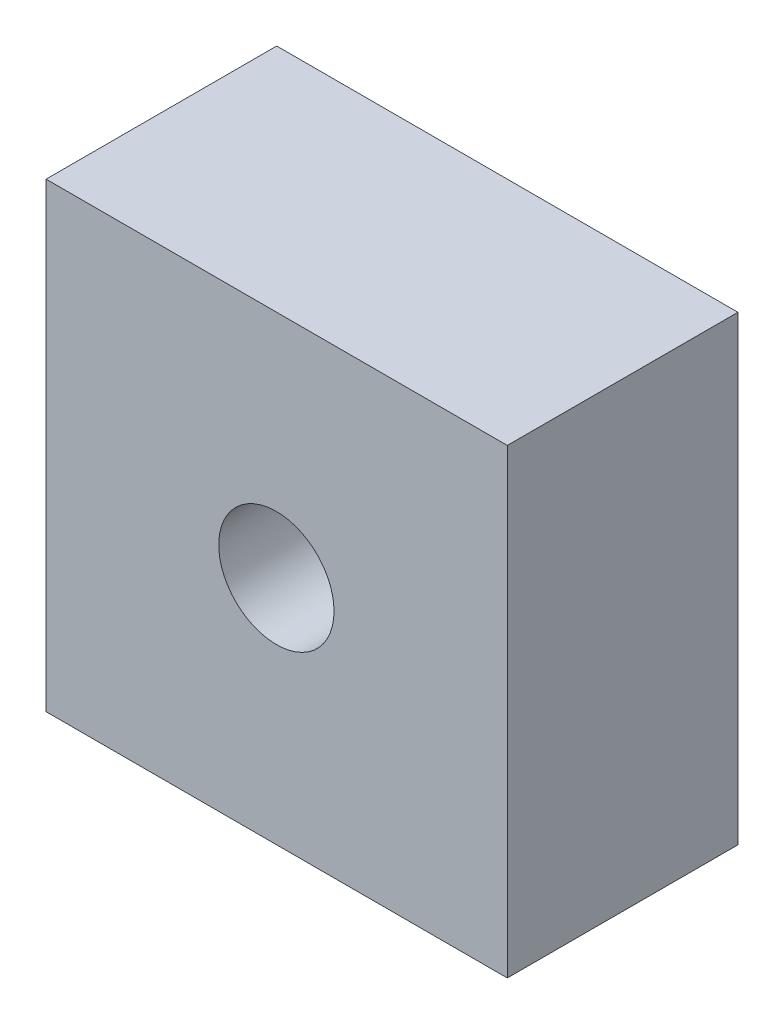
ISO-10303-21;
HEADER;
FILE_DESCRIPTION(('STEP AP214'),'2;1');
FILE_NAME('part.step','',(''),(''),'','','');
FILE_SCHEMA(('AUTOMOTIVE_DESIGN { 1 0 10303 214 1 1 1 1 }'));
ENDSEC;
DATA;
#1=APPLICATION_CONTEXT('core data for automotive mechanical design processes');
#2=APPLICATION_PROTOCOL_DEFINITION('international standard','automotive_design',2000,#1);
#3=PRODUCT_CONTEXT('',#1,'mechanical');
#4=PRODUCT('Part','Part','',(#3));
#5=PRODUCT_RELATED_PRODUCT_CATEGORY('part','',(#4));
#6=PRODUCT_DEFINITION_FORMATION('','',#4);
#7=PRODUCT_DEFINITION_CONTEXT('part definition',#1,'design');
#8=PRODUCT_DEFINITION('design','',#6,#7);
#9=PRODUCT_DEFINITION_SHAPE('','',#8);
#10=(LENGTH_UNIT() NAMED_UNIT(*) SI_UNIT(.MILLI.,.METRE.));
#11=(NAMED_UNIT(*) PLANE_ANGLE_UNIT() SI_UNIT($,.RADIAN.));
#12=(NAMED_UNIT(*) SI_UNIT($,.STERADIAN.) SOLID_ANGLE_UNIT());
#13=UNCERTAINTY_MEASURE_WITH_UNIT(LENGTH_MEASURE(1.E-05),#10,'distance_accuracy_value','');
#14=(GEOMETRIC_REPRESENTATION_CONTEXT(3) GLOBAL_UNCERTAINTY_ASSIGNED_CONTEXT((#13)) GLOBAL_UNIT_ASSIGNED_CONTEXT((#10,
#11,#12)) REPRESENTATION_CONTEXT('',''));
#15=CARTESIAN_POINT('',(0.,0.,0.));
#16=DIRECTION('',(0.,0.,1.));
#17=DIRECTION('',(1.,0.,0.));
#18=AXIS2_PLACEMENT_3D('',#15,#16,#17);
#19=CARTESIAN_POINT('',(0.,0.,10.));
#20=DIRECTION('',(1.,0.,0.));
#21=DIRECTION('',(0.,0.,-1.));
#22=AXIS2_PLACEMENT_3D('',#19,#20,#21);
#23=PLANE('',#22);
#24=DIRECTION('',(0.,-1.,0.));
#25=VECTOR('',#24,1.);
#26=CARTESIAN_POINT('',(0.,0.,0.));
#27=LINE('',#26,#25);
#28=CARTESIAN_POINT('',(0.,20.,0.));
#29=VERTEX_POINT('',#28);
#30=CARTESIAN_POINT('',(0.,0.,0.));
#31=VERTEX_POINT('',#30);
#32=EDGE_CURVE('E104',#29,#31,#27,.T.);
#33=ORIENTED_EDGE('',*,*,#32,.T.);
#34=DIRECTION('',(0.,0.,-1.));
#35=VECTOR('',#34,1.);
#36=CARTESIAN_POINT('',(0.,0.,10.));
#37=LINE('',#36,#35);
#38=CARTESIAN_POINT('',(0.,0.,10.));
#39=VERTEX_POINT('',#38);
#40=EDGE_CURVE('E11',#39,#31,#37,.T.);
#41=ORIENTED_EDGE('',*,*,#40,.F.);
#42=DIRECTION('',(0.,-1.,0.));
#43=VECTOR('',#42,1.);
#44=CARTESIAN_POINT('',(0.,0.,10.));
#45=LINE('',#44,#43);
#46=CARTESIAN_POINT('',(0.,20.,10.));
#47=VERTEX_POINT('',#46);
#48=EDGE_CURVE('E91',#47,#39,#45,.T.);
#49=ORIENTED_EDGE('',*,*,#48,.F.);
#50=DIRECTION('',(0.,0.,-1.));
#51=VECTOR('',#50,1.);
#52=CARTESIAN_POINT('',(0.,20.,10.));
#53=LINE('',#52,#51);
#54=EDGE_CURVE('E101',#47,#29,#53,.T.);
#55=ORIENTED_EDGE('',*,*,#54,.T.);
#56=EDGE_LOOP('',(#33,#41,#49,#55));
#57=FACE_BOUND('',#56,.T.);
#58=ADVANCED_FACE('F45',(#57),#23,.F.);
#59=CARTESIAN_POINT('',(0.,0.,10.));
#60=DIRECTION('',(0.,1.,0.));
#61=DIRECTION('',(0.,0.,1.));
#62=AXIS2_PLACEMENT_3D('',#59,#60,#61);
#63=PLANE('',#62);
#64=DIRECTION('',(1.,0.,0.));
#65=VECTOR('',#64,1.);
#66=CARTESIAN_POINT('',(0.,0.,0.));
#67=LINE('',#66,#65);
#68=CARTESIAN_POINT('',(20.,0.,0.));
#69=VERTEX_POINT('',#68);
#70=EDGE_CURVE('E100',#31,#69,#67,.T.);
#71=ORIENTED_EDGE('',*,*,#70,.T.);
#72=DIRECTION('',(0.,0.,-1.));
#73=VECTOR('',#72,1.);
#74=CARTESIAN_POINT('',(20.,0.,10.));
#75=LINE('',#74,#73);
#76=CARTESIAN_POINT('',(20.,0.,10.));
#77=VERTEX_POINT('',#76);
#78=EDGE_CURVE('E49',#77,#69,#75,.T.);
#79=ORIENTED_EDGE('',*,*,#78,.F.);
#80=DIRECTION('',(1.,0.,0.));
#81=VECTOR('',#80,1.);
#82=CARTESIAN_POINT('',(0.,0.,10.));
#83=LINE('',#82,#81);
#84=EDGE_CURVE('E86',#39,#77,#83,.T.);
#85=ORIENTED_EDGE('',*,*,#84,.F.);
#86=ORIENTED_EDGE('',*,*,#40,.T.);
#87=EDGE_LOOP('',(#71,#79,#85,#86));
#88=FACE_BOUND('',#87,.T.);
#89=ADVANCED_FACE('F96',(#88),#63,.F.);
#90=CARTESIAN_POINT('',(20.,0.,10.));
#91=DIRECTION('',(-1.,0.,0.));
#92=DIRECTION('',(0.,0.,1.));
#93=AXIS2_PLACEMENT_3D('',#90,#91,#92);
#94=PLANE('',#93);
#95=DIRECTION('',(0.,1.,0.));
#96=VECTOR('',#95,1.);
#97=CARTESIAN_POINT('',(20.,0.,0.));
#98=LINE('',#97,#96);
#99=CARTESIAN_POINT('',(20.,20.,0.));
#100=VERTEX_POINT('',#99);
#101=EDGE_CURVE('E73',#69,#100,#98,.T.);
#102=ORIENTED_EDGE('',*,*,#101,.T.);
#103=DIRECTION('',(0.,0.,-1.));
#104=VECTOR('',#103,1.);
#105=CARTESIAN_POINT('',(20.,20.,10.));
#106=LINE('',#105,#104);
#107=CARTESIAN_POINT('',(20.,20.,10.));
#108=VERTEX_POINT('',#107);
#109=EDGE_CURVE('E98',#108,#100,#106,.T.);
#110=ORIENTED_EDGE('',*,*,#109,.F.);
#111=DIRECTION('',(0.,1.,0.));
#112=VECTOR('',#111,1.);
#113=CARTESIAN_POINT('',(20.,0.,10.));
#114=LINE('',#113,#112);
#115=EDGE_CURVE('E93',#77,#108,#114,.T.);
#116=ORIENTED_EDGE('',*,*,#115,.F.);
#117=ORIENTED_EDGE('',*,*,#78,.T.);
#118=EDGE_LOOP('',(#102,#110,#116,#117));
#119=FACE_BOUND('',#118,.T.);
#120=ADVANCED_FACE('F97',(#119),#94,.F.);
#121=CARTESIAN_POINT('',(0.,20.,10.));
#122=DIRECTION('',(0.,-1.,0.));
#123=DIRECTION('',(0.,0.,-1.));
#124=AXIS2_PLACEMENT_3D('',#121,#122,#123);
#125=PLANE('',#124);
#126=DIRECTION('',(-1.,0.,0.));
#127=VECTOR('',#126,1.);
#128=CARTESIAN_POINT('',(0.,20.,0.));
#129=LINE('',#128,#127);
#130=EDGE_CURVE('E81',#100,#29,#129,.T.);
#131=ORIENTED_EDGE('',*,*,#130,.T.);
#132=ORIENTED_EDGE('',*,*,#54,.F.);
#133=DIRECTION('',(-1.,0.,0.));
#134=VECTOR('',#133,1.);
#135=CARTESIAN_POINT('',(0.,20.,10.));
#136=LINE('',#135,#134);
#137=EDGE_CURVE('E59',#108,#47,#136,.T.);
#138=ORIENTED_EDGE('',*,*,#137,.F.);
#139=ORIENTED_EDGE('',*,*,#109,.T.);
#140=EDGE_LOOP('',(#131,#132,#138,#139));
#141=FACE_BOUND('',#140,.T.);
#142=ADVANCED_FACE('F114',(#141),#125,.F.);
#143=CARTESIAN_POINT('',(0.,0.,10.));
#144=DIRECTION('',(0.,0.,-1.));
#145=DIRECTION('',(-1.,0.,0.));
#146=AXIS2_PLACEMENT_3D('',#143,#144,#145);
#147=PLANE('',#146);
#148=CARTESIAN_POINT('',(9.98648737498797,10.0143055988724,10.));
#149=DIRECTION('',(0.,0.,1.));
#150=DIRECTION('',(1.,0.,0.));
#151=AXIS2_PLACEMENT_3D('',#148,#149,#150);
#152=CIRCLE('',#151,2.50000000000001);
#153=CARTESIAN_POINT('',(12.486487374988,10.0143055988724,10.));
#154=VERTEX_POINT('',#153);
#155=EDGE_CURVE('E123',#154,#154,#152,.T.);
#156=ORIENTED_EDGE('',*,*,#155,.F.);
#157=EDGE_LOOP('',(#156));
#158=FACE_BOUND('',#157,.T.);
#159=ORIENTED_EDGE('',*,*,#48,.T.);
#160=ORIENTED_EDGE('',*,*,#84,.T.);
#161=ORIENTED_EDGE('',*,*,#115,.T.);
#162=ORIENTED_EDGE('',*,*,#137,.T.);
#163=EDGE_LOOP('',(#159,#160,#161,#162));
#164=FACE_BOUND('',#163,.T.);
#165=ADVANCED_FACE('F90',(#158,#164),#147,.F.);
#166=CARTESIAN_POINT('',(0.,0.,0.));
#167=DIRECTION('',(0.,0.,-1.));
#168=DIRECTION('',(-1.,0.,0.));
#169=AXIS2_PLACEMENT_3D('',#166,#167,#168);
#170=PLANE('',#169);
#171=CARTESIAN_POINT('',(9.98648737498797,10.0143055988724,0.));
#172=DIRECTION('',(0.,0.,-1.));
#173=DIRECTION('',(-1.,0.,0.));
#174=AXIS2_PLACEMENT_3D('',#171,#172,#173);
#175=CIRCLE('',#174,2.50000000000001);
#176=CARTESIAN_POINT('',(7.48648737498796,10.0143055988724,0.));
#177=VERTEX_POINT('',#176);
#178=EDGE_CURVE('E107',#177,#177,#175,.T.);
#179=ORIENTED_EDGE('',*,*,#178,.F.);
#180=EDGE_LOOP('',(#179));
#181=FACE_BOUND('',#180,.T.);
#182=ORIENTED_EDGE('',*,*,#32,.F.);
#183=ORIENTED_EDGE('',*,*,#130,.F.);
#184=ORIENTED_EDGE('',*,*,#101,.F.);
#185=ORIENTED_EDGE('',*,*,#70,.F.);
#186=EDGE_LOOP('',(#182,#183,#184,#185));
#187=FACE_BOUND('',#186,.T.);
#188=ADVANCED_FACE('F118',(#181,#187),#170,.T.);
#189=CARTESIAN_POINT('',(9.98648737498797,10.0143055988724,10.));
#190=DIRECTION('',(0.,0.,1.));
#191=DIRECTION('',(1.,0.,0.));
#192=AXIS2_PLACEMENT_3D('',#189,#190,#191);
#193=CYLINDRICAL_SURFACE('',#192,2.50000000000001);
#194=ORIENTED_EDGE('',*,*,#178,.T.);
#195=EDGE_LOOP('',(#194));
#196=FACE_BOUND('',#195,.T.);
#197=ORIENTED_EDGE('',*,*,#155,.T.);
#198=EDGE_LOOP('',(#197));
#199=FACE_BOUND('',#198,.T.);
#200=ADVANCED_FACE('F122',(#196,#199),#193,.F.);
#201=CLOSED_SHELL('',(#58,#89,#120,#142,#165,#188,#200));
#202=MANIFOLD_SOLID_BREP('B2',#201);
#203=ADVANCED_BREP_SHAPE_REPRESENTATION('',(#18,#202),#14);
#204=SHAPE_DEFINITION_REPRESENTATION(#9,#203);
ENDSEC;
END-ISO-10303-21;
